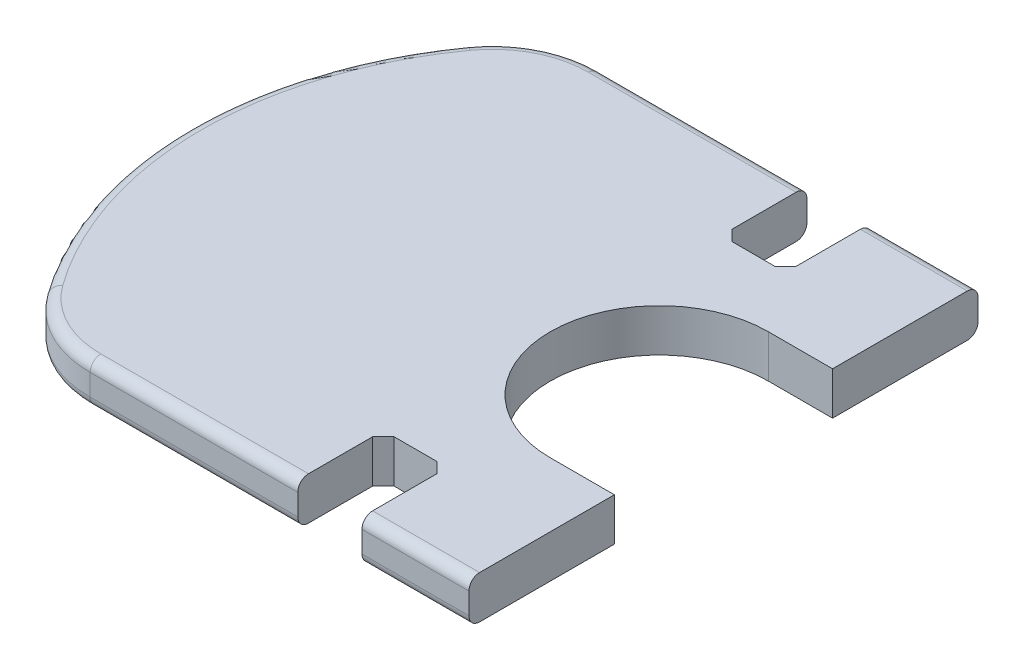
ISO-10303-21;
HEADER;
FILE_DESCRIPTION(('STEP AP214'),'2;1');
FILE_NAME('part.step','',(''),(''),'','','');
FILE_SCHEMA(('AUTOMOTIVE_DESIGN { 1 0 10303 214 1 1 1 1 }'));
ENDSEC;
DATA;
#1=APPLICATION_CONTEXT('core data for automotive mechanical design processes');
#2=APPLICATION_PROTOCOL_DEFINITION('international standard','automotive_design',2000,#1);
#3=PRODUCT_CONTEXT('',#1,'mechanical');
#4=PRODUCT('Part','Part','',(#3));
#5=PRODUCT_RELATED_PRODUCT_CATEGORY('part','',(#4));
#6=PRODUCT_DEFINITION_FORMATION('','',#4);
#7=PRODUCT_DEFINITION_CONTEXT('part definition',#1,'design');
#8=PRODUCT_DEFINITION('design','',#6,#7);
#9=PRODUCT_DEFINITION_SHAPE('','',#8);
#10=(LENGTH_UNIT() NAMED_UNIT(*) SI_UNIT(.MILLI.,.METRE.));
#11=(NAMED_UNIT(*) PLANE_ANGLE_UNIT() SI_UNIT($,.RADIAN.));
#12=(NAMED_UNIT(*) SI_UNIT($,.STERADIAN.) SOLID_ANGLE_UNIT());
#13=UNCERTAINTY_MEASURE_WITH_UNIT(LENGTH_MEASURE(1.E-05),#10,'distance_accuracy_value','');
#14=(GEOMETRIC_REPRESENTATION_CONTEXT(3) GLOBAL_UNCERTAINTY_ASSIGNED_CONTEXT((#13)) GLOBAL_UNIT_ASSIGNED_CONTEXT((#10,
#11,#12)) REPRESENTATION_CONTEXT('',''));
#15=CARTESIAN_POINT('',(0.,0.,0.));
#16=DIRECTION('',(0.,0.,1.));
#17=DIRECTION('',(1.,0.,0.));
#18=AXIS2_PLACEMENT_3D('',#15,#16,#17);
#19=CARTESIAN_POINT('',(3.,2.,-11.9));
#20=DIRECTION('',(0.,0.,1.));
#21=DIRECTION('',(1.,0.,0.));
#22=AXIS2_PLACEMENT_3D('',#19,#20,#21);
#23=PLANE('',#22);
#24=DIRECTION('',(-1.,0.,0.));
#25=VECTOR('',#24,1.);
#26=CARTESIAN_POINT('',(3.,0.5,-11.9));
#27=LINE('',#26,#25);
#28=CARTESIAN_POINT('',(3.,0.5,-11.9));
#29=VERTEX_POINT('',#28);
#30=CARTESIAN_POINT('',(-2.,0.5,-11.9));
#31=VERTEX_POINT('',#30);
#32=EDGE_CURVE('E315',#29,#31,#27,.T.);
#33=ORIENTED_EDGE('',*,*,#32,.T.);
#34=DIRECTION('',(0.,1.,0.));
#35=VECTOR('',#34,1.);
#36=CARTESIAN_POINT('',(-2.,2.,-11.9));
#37=LINE('',#36,#35);
#38=CARTESIAN_POINT('',(-2.,1.5,-11.9));
#39=VERTEX_POINT('',#38);
#40=EDGE_CURVE('E565',#31,#39,#37,.T.);
#41=ORIENTED_EDGE('',*,*,#40,.T.);
#42=DIRECTION('',(-1.,0.,0.));
#43=VECTOR('',#42,1.);
#44=CARTESIAN_POINT('',(3.,1.5,-11.9));
#45=LINE('',#44,#43);
#46=CARTESIAN_POINT('',(3.,1.5,-11.9));
#47=VERTEX_POINT('',#46);
#48=EDGE_CURVE('E309',#39,#47,#45,.F.);
#49=ORIENTED_EDGE('',*,*,#48,.T.);
#50=DIRECTION('',(0.,-1.,0.));
#51=VECTOR('',#50,1.);
#52=CARTESIAN_POINT('',(3.,2.,-11.9));
#53=LINE('',#52,#51);
#54=EDGE_CURVE('E661',#47,#29,#53,.T.);
#55=ORIENTED_EDGE('',*,*,#54,.T.);
#56=EDGE_LOOP('',(#33,#41,#49,#55));
#57=FACE_BOUND('',#56,.T.);
#58=ADVANCED_FACE('F40',(#57),#23,.F.);
#59=CARTESIAN_POINT('',(3.,2.,11.9));
#60=DIRECTION('',(0.,0.,-1.));
#61=DIRECTION('',(-1.,0.,0.));
#62=AXIS2_PLACEMENT_3D('',#59,#60,#61);
#63=PLANE('',#62);
#64=DIRECTION('',(1.,0.,0.));
#65=VECTOR('',#64,1.);
#66=CARTESIAN_POINT('',(-14.7082561413402,1.5,11.9));
#67=LINE('',#66,#65);
#68=CARTESIAN_POINT('',(3.,1.5,11.9));
#69=VERTEX_POINT('',#68);
#70=CARTESIAN_POINT('',(-2.,1.5,11.9));
#71=VERTEX_POINT('',#70);
#72=EDGE_CURVE('E296',#69,#71,#67,.F.);
#73=ORIENTED_EDGE('',*,*,#72,.T.);
#74=DIRECTION('',(0.,-1.,0.));
#75=VECTOR('',#74,1.);
#76=CARTESIAN_POINT('',(-2.,2.,11.9));
#77=LINE('',#76,#75);
#78=CARTESIAN_POINT('',(-2.,0.5,11.9));
#79=VERTEX_POINT('',#78);
#80=EDGE_CURVE('E255',#71,#79,#77,.T.);
#81=ORIENTED_EDGE('',*,*,#80,.T.);
#82=DIRECTION('',(1.,0.,0.));
#83=VECTOR('',#82,1.);
#84=CARTESIAN_POINT('',(3.,0.5,11.9));
#85=LINE('',#84,#83);
#86=CARTESIAN_POINT('',(3.,0.5,11.9));
#87=VERTEX_POINT('',#86);
#88=EDGE_CURVE('E299',#79,#87,#85,.T.);
#89=ORIENTED_EDGE('',*,*,#88,.T.);
#90=DIRECTION('',(0.,-1.,0.));
#91=VECTOR('',#90,1.);
#92=CARTESIAN_POINT('',(3.,2.,11.9));
#93=LINE('',#92,#91);
#94=EDGE_CURVE('E657',#69,#87,#93,.T.);
#95=ORIENTED_EDGE('',*,*,#94,.F.);
#96=EDGE_LOOP('',(#73,#81,#89,#95));
#97=FACE_BOUND('',#96,.T.);
#98=ADVANCED_FACE('F711',(#97),#63,.F.);
#99=CARTESIAN_POINT('',(3.,0.5,-11.4));
#100=DIRECTION('',(-1.,0.,0.));
#101=DIRECTION('',(0.,0.,1.));
#102=AXIS2_PLACEMENT_3D('',#99,#100,#101);
#103=CYLINDRICAL_SURFACE('',#102,0.5);
#104=CARTESIAN_POINT('',(-2.,0.5,-11.4));
#105=DIRECTION('',(1.,0.,0.));
#106=DIRECTION('',(0.,0.,-1.));
#107=AXIS2_PLACEMENT_3D('',#104,#105,#106);
#108=CIRCLE('',#107,0.5);
#109=CARTESIAN_POINT('',(-2.,0.,-11.4));
#110=VERTEX_POINT('',#109);
#111=EDGE_CURVE('E610',#31,#110,#108,.F.);
#112=ORIENTED_EDGE('',*,*,#111,.F.);
#113=ORIENTED_EDGE('',*,*,#32,.F.);
#114=CARTESIAN_POINT('',(3.,0.5,-11.4));
#115=DIRECTION('',(-1.,0.,0.));
#116=DIRECTION('',(0.,0.,1.));
#117=AXIS2_PLACEMENT_3D('',#114,#115,#116);
#118=CIRCLE('',#117,0.5);
#119=CARTESIAN_POINT('',(3.,0.,-11.4));
#120=VERTEX_POINT('',#119);
#121=EDGE_CURVE('E322',#120,#29,#118,.F.);
#122=ORIENTED_EDGE('',*,*,#121,.F.);
#123=DIRECTION('',(-1.,0.,0.));
#124=VECTOR('',#123,1.);
#125=CARTESIAN_POINT('',(0.,0.,-11.4));
#126=LINE('',#125,#124);
#127=EDGE_CURVE('E508',#110,#120,#126,.F.);
#128=ORIENTED_EDGE('',*,*,#127,.F.);
#129=EDGE_LOOP('',(#112,#113,#122,#128));
#130=FACE_BOUND('',#129,.T.);
#131=ADVANCED_FACE('F691',(#130),#103,.T.);
#132=CARTESIAN_POINT('',(3.,0.5,11.4));
#133=DIRECTION('',(1.,0.,0.));
#134=DIRECTION('',(0.,0.,-1.));
#135=AXIS2_PLACEMENT_3D('',#132,#133,#134);
#136=CYLINDRICAL_SURFACE('',#135,0.5);
#137=CARTESIAN_POINT('',(-2.,0.5,11.4));
#138=DIRECTION('',(1.,0.,0.));
#139=DIRECTION('',(0.,0.,-1.));
#140=AXIS2_PLACEMENT_3D('',#137,#138,#139);
#141=CIRCLE('',#140,0.5);
#142=CARTESIAN_POINT('',(-2.,0.,11.4));
#143=VERTEX_POINT('',#142);
#144=EDGE_CURVE('E597',#143,#79,#141,.F.);
#145=ORIENTED_EDGE('',*,*,#144,.F.);
#146=DIRECTION('',(1.,0.,0.));
#147=VECTOR('',#146,1.);
#148=CARTESIAN_POINT('',(0.,0.,11.4));
#149=LINE('',#148,#147);
#150=CARTESIAN_POINT('',(3.,0.,11.4));
#151=VERTEX_POINT('',#150);
#152=EDGE_CURVE('E450',#151,#143,#149,.F.);
#153=ORIENTED_EDGE('',*,*,#152,.F.);
#154=CARTESIAN_POINT('',(3.,0.5,11.4));
#155=DIRECTION('',(-1.,0.,0.));
#156=DIRECTION('',(0.,0.,1.));
#157=AXIS2_PLACEMENT_3D('',#154,#155,#156);
#158=CIRCLE('',#157,0.5);
#159=EDGE_CURVE('E306',#87,#151,#158,.F.);
#160=ORIENTED_EDGE('',*,*,#159,.F.);
#161=ORIENTED_EDGE('',*,*,#88,.F.);
#162=EDGE_LOOP('',(#145,#153,#160,#161));
#163=FACE_BOUND('',#162,.T.);
#164=ADVANCED_FACE('F708',(#163),#136,.T.);
#165=CARTESIAN_POINT('',(0.,1.5,-11.4));
#166=DIRECTION('',(1.,0.,0.));
#167=DIRECTION('',(0.,0.,-1.));
#168=AXIS2_PLACEMENT_3D('',#165,#166,#167);
#169=CYLINDRICAL_SURFACE('',#168,0.5);
#170=CARTESIAN_POINT('',(-2.,1.5,-11.4));
#171=DIRECTION('',(1.,0.,0.));
#172=DIRECTION('',(0.,0.,-1.));
#173=AXIS2_PLACEMENT_3D('',#170,#171,#172);
#174=CIRCLE('',#173,0.5);
#175=CARTESIAN_POINT('',(-2.,2.,-11.4));
#176=VERTEX_POINT('',#175);
#177=EDGE_CURVE('E361',#176,#39,#174,.F.);
#178=ORIENTED_EDGE('',*,*,#177,.F.);
#179=DIRECTION('',(-1.,0.,0.));
#180=VECTOR('',#179,1.);
#181=CARTESIAN_POINT('',(-14.7082561413402,2.,-11.4));
#182=LINE('',#181,#180);
#183=CARTESIAN_POINT('',(3.,2.,-11.4));
#184=VERTEX_POINT('',#183);
#185=EDGE_CURVE('E489',#184,#176,#182,.T.);
#186=ORIENTED_EDGE('',*,*,#185,.F.);
#187=CARTESIAN_POINT('',(3.,1.5,-11.4));
#188=DIRECTION('',(-1.,0.,0.));
#189=DIRECTION('',(0.,0.,1.));
#190=AXIS2_PLACEMENT_3D('',#187,#188,#189);
#191=CIRCLE('',#190,0.5);
#192=EDGE_CURVE('E319',#47,#184,#191,.F.);
#193=ORIENTED_EDGE('',*,*,#192,.F.);
#194=ORIENTED_EDGE('',*,*,#48,.F.);
#195=EDGE_LOOP('',(#178,#186,#193,#194));
#196=FACE_BOUND('',#195,.T.);
#197=ADVANCED_FACE('F698',(#196),#169,.T.);
#198=CARTESIAN_POINT('',(0.,1.5,11.4));
#199=DIRECTION('',(-1.,0.,0.));
#200=DIRECTION('',(0.,0.,1.));
#201=AXIS2_PLACEMENT_3D('',#198,#199,#200);
#202=CYLINDRICAL_SURFACE('',#201,0.5);
#203=CARTESIAN_POINT('',(-2.,1.5,11.4));
#204=DIRECTION('',(1.,0.,0.));
#205=DIRECTION('',(0.,0.,-1.));
#206=AXIS2_PLACEMENT_3D('',#203,#204,#205);
#207=CIRCLE('',#206,0.5);
#208=CARTESIAN_POINT('',(-2.,2.,11.4));
#209=VERTEX_POINT('',#208);
#210=EDGE_CURVE('E249',#71,#209,#207,.F.);
#211=ORIENTED_EDGE('',*,*,#210,.F.);
#212=ORIENTED_EDGE('',*,*,#72,.F.);
#213=CARTESIAN_POINT('',(3.,1.5,11.4));
#214=DIRECTION('',(-1.,0.,0.));
#215=DIRECTION('',(0.,0.,1.));
#216=AXIS2_PLACEMENT_3D('',#213,#214,#215);
#217=CIRCLE('',#216,0.5);
#218=CARTESIAN_POINT('',(3.,2.,11.4));
#219=VERTEX_POINT('',#218);
#220=EDGE_CURVE('E276',#219,#69,#217,.F.);
#221=ORIENTED_EDGE('',*,*,#220,.F.);
#222=DIRECTION('',(1.,0.,0.));
#223=VECTOR('',#222,1.);
#224=CARTESIAN_POINT('',(3.,2.,11.4));
#225=LINE('',#224,#223);
#226=EDGE_CURVE('E266',#209,#219,#225,.T.);
#227=ORIENTED_EDGE('',*,*,#226,.F.);
#228=EDGE_LOOP('',(#211,#212,#221,#227));
#229=FACE_BOUND('',#228,.T.);
#230=ADVANCED_FACE('F275',(#229),#202,.T.);
#231=CARTESIAN_POINT('',(0.,2.,0.));
#232=DIRECTION('',(0.,-1.,0.));
#233=DIRECTION('',(0.,0.,-1.));
#234=AXIS2_PLACEMENT_3D('',#231,#232,#233);
#235=CYLINDRICAL_SURFACE('',#234,5.1);
#236=CARTESIAN_POINT('',(0.,0.,0.));
#237=DIRECTION('',(0.,-1.,0.));
#238=DIRECTION('',(0.,0.,1.));
#239=AXIS2_PLACEMENT_3D('',#236,#237,#238);
#240=CIRCLE('',#239,5.1);
#241=CARTESIAN_POINT('',(0.,0.,5.1));
#242=VERTEX_POINT('',#241);
#243=CARTESIAN_POINT('',(0.,0.,-5.1));
#244=VERTEX_POINT('',#243);
#245=EDGE_CURVE('E341',#242,#244,#240,.T.);
#246=ORIENTED_EDGE('',*,*,#245,.T.);
#247=DIRECTION('',(0.,-1.,0.));
#248=VECTOR('',#247,1.);
#249=CARTESIAN_POINT('',(0.,2.,-5.1));
#250=LINE('',#249,#248);
#251=CARTESIAN_POINT('',(0.,2.,-5.1));
#252=VERTEX_POINT('',#251);
#253=EDGE_CURVE('E442',#252,#244,#250,.T.);
#254=ORIENTED_EDGE('',*,*,#253,.F.);
#255=CARTESIAN_POINT('',(0.,2.,0.));
#256=DIRECTION('',(0.,-1.,0.));
#257=DIRECTION('',(0.,0.,1.));
#258=AXIS2_PLACEMENT_3D('',#255,#256,#257);
#259=CIRCLE('',#258,5.1);
#260=CARTESIAN_POINT('',(0.,2.,5.1));
#261=VERTEX_POINT('',#260);
#262=EDGE_CURVE('E616',#261,#252,#259,.T.);
#263=ORIENTED_EDGE('',*,*,#262,.F.);
#264=DIRECTION('',(0.,-1.,0.));
#265=VECTOR('',#264,1.);
#266=CARTESIAN_POINT('',(0.,2.,5.1));
#267=LINE('',#266,#265);
#268=EDGE_CURVE('E634',#261,#242,#267,.T.);
#269=ORIENTED_EDGE('',*,*,#268,.T.);
#270=EDGE_LOOP('',(#246,#254,#263,#269));
#271=FACE_BOUND('',#270,.T.);
#272=ADVANCED_FACE('F678',(#271),#235,.F.);
#273=CARTESIAN_POINT('',(0.,2.,-5.1));
#274=DIRECTION('',(0.,0.,-1.));
#275=DIRECTION('',(-1.,0.,0.));
#276=AXIS2_PLACEMENT_3D('',#273,#274,#275);
#277=PLANE('',#276);
#278=DIRECTION('',(1.,0.,0.));
#279=VECTOR('',#278,1.);
#280=CARTESIAN_POINT('',(0.,0.,-5.1));
#281=LINE('',#280,#279);
#282=CARTESIAN_POINT('',(3.,0.,-5.1));
#283=VERTEX_POINT('',#282);
#284=EDGE_CURVE('E638',#244,#283,#281,.T.);
#285=ORIENTED_EDGE('',*,*,#284,.T.);
#286=DIRECTION('',(0.,-1.,0.));
#287=VECTOR('',#286,1.);
#288=CARTESIAN_POINT('',(3.,2.,-5.1));
#289=LINE('',#288,#287);
#290=CARTESIAN_POINT('',(3.,2.,-5.1));
#291=VERTEX_POINT('',#290);
#292=EDGE_CURVE('E665',#291,#283,#289,.T.);
#293=ORIENTED_EDGE('',*,*,#292,.F.);
#294=DIRECTION('',(1.,0.,0.));
#295=VECTOR('',#294,1.);
#296=CARTESIAN_POINT('',(0.,2.,-5.1));
#297=LINE('',#296,#295);
#298=EDGE_CURVE('E620',#252,#291,#297,.T.);
#299=ORIENTED_EDGE('',*,*,#298,.F.);
#300=ORIENTED_EDGE('',*,*,#253,.T.);
#301=EDGE_LOOP('',(#285,#293,#299,#300));
#302=FACE_BOUND('',#301,.T.);
#303=ADVANCED_FACE('F673',(#302),#277,.F.);
#304=CARTESIAN_POINT('',(3.,2.,-5.1));
#305=DIRECTION('',(-1.,0.,0.));
#306=DIRECTION('',(0.,0.,1.));
#307=AXIS2_PLACEMENT_3D('',#304,#305,#306);
#308=PLANE('',#307);
#309=DIRECTION('',(0.,0.,-1.));
#310=VECTOR('',#309,1.);
#311=CARTESIAN_POINT('',(3.,0.,-5.1));
#312=LINE('',#311,#310);
#313=EDGE_CURVE('E641',#283,#120,#312,.T.);
#314=ORIENTED_EDGE('',*,*,#313,.T.);
#315=ORIENTED_EDGE('',*,*,#121,.T.);
#316=ORIENTED_EDGE('',*,*,#54,.F.);
#317=ORIENTED_EDGE('',*,*,#192,.T.);
#318=DIRECTION('',(0.,0.,-1.));
#319=VECTOR('',#318,1.);
#320=CARTESIAN_POINT('',(3.,2.,-5.1));
#321=LINE('',#320,#319);
#322=EDGE_CURVE('E624',#291,#184,#321,.T.);
#323=ORIENTED_EDGE('',*,*,#322,.F.);
#324=ORIENTED_EDGE('',*,*,#292,.T.);
#325=EDGE_LOOP('',(#314,#315,#316,#317,#323,#324));
#326=FACE_BOUND('',#325,.T.);
#327=ADVANCED_FACE('F685',(#326),#308,.F.);
#328=CARTESIAN_POINT('',(-14.7082561413402,1.5,-11.9));
#329=VERTEX_POINT('',#328);
#330=CARTESIAN_POINT('',(-5.,1.5,-11.9));
#331=VERTEX_POINT('',#330);
#332=EDGE_CURVE('E310',#329,#331,#45,.F.);
#333=ORIENTED_EDGE('',*,*,#332,.T.);
#334=DIRECTION('',(0.,-1.,0.));
#335=VECTOR('',#334,1.);
#336=CARTESIAN_POINT('',(-5.,2.,-11.9));
#337=LINE('',#336,#335);
#338=CARTESIAN_POINT('',(-5.,0.5,-11.9));
#339=VERTEX_POINT('',#338);
#340=EDGE_CURVE('E503',#331,#339,#337,.T.);
#341=ORIENTED_EDGE('',*,*,#340,.T.);
#342=CARTESIAN_POINT('',(-14.7082561413402,0.5,-11.9));
#343=VERTEX_POINT('',#342);
#344=EDGE_CURVE('E314',#339,#343,#27,.T.);
#345=ORIENTED_EDGE('',*,*,#344,.T.);
#346=DIRECTION('',(0.,-1.,0.));
#347=VECTOR('',#346,1.);
#348=CARTESIAN_POINT('',(-14.7082561413402,2.,-11.9));
#349=LINE('',#348,#347);
#350=EDGE_CURVE('E505',#343,#329,#349,.F.);
#351=ORIENTED_EDGE('',*,*,#350,.T.);
#352=EDGE_LOOP('',(#333,#341,#345,#351));
#353=FACE_BOUND('',#352,.T.);
#354=ADVANCED_FACE('F502',(#353),#23,.F.);
#355=CARTESIAN_POINT('',(-5.09999999999997,2.,0.));
#356=DIRECTION('',(0.,-1.,0.));
#357=DIRECTION('',(0.,0.,-1.));
#358=AXIS2_PLACEMENT_3D('',#355,#356,#357);
#359=CYLINDRICAL_SURFACE('',#358,16.8291413922398);
#360=DIRECTION('',(0.,-1.,0.));
#361=VECTOR('',#360,1.);
#362=CARTESIAN_POINT('',(-18.7695213772277,2.,-9.81652613287999));
#363=LINE('',#362,#361);
#364=CARTESIAN_POINT('',(-18.7695213772277,1.5,-9.81652613287999));
#365=VERTEX_POINT('',#364);
#366=CARTESIAN_POINT('',(-18.7695213772277,0.5,-9.81652613287999));
#367=VERTEX_POINT('',#366);
#368=EDGE_CURVE('E441',#365,#367,#363,.T.);
#369=ORIENTED_EDGE('',*,*,#368,.T.);
#370=CARTESIAN_POINT('',(-5.09999999999997,0.5,0.));
#371=DIRECTION('',(0.,1.,0.));
#372=DIRECTION('',(0.,0.,1.));
#373=AXIS2_PLACEMENT_3D('',#370,#371,#372);
#374=CIRCLE('',#373,16.8291413922398);
#375=CARTESIAN_POINT('',(-18.7695213772277,0.5,9.81652613287999));
#376=VERTEX_POINT('',#375);
#377=EDGE_CURVE('E292',#367,#376,#374,.T.);
#378=ORIENTED_EDGE('',*,*,#377,.T.);
#379=DIRECTION('',(0.,-1.,0.));
#380=VECTOR('',#379,1.);
#381=CARTESIAN_POINT('',(-18.7695213772277,2.,9.81652613287999));
#382=LINE('',#381,#380);
#383=CARTESIAN_POINT('',(-18.7695213772277,1.5,9.81652613287999));
#384=VERTEX_POINT('',#383);
#385=EDGE_CURVE('E467',#376,#384,#382,.F.);
#386=ORIENTED_EDGE('',*,*,#385,.T.);
#387=CARTESIAN_POINT('',(-5.09999999999997,1.5,0.));
#388=DIRECTION('',(0.,1.,0.));
#389=DIRECTION('',(0.,0.,1.));
#390=AXIS2_PLACEMENT_3D('',#387,#388,#389);
#391=CIRCLE('',#390,16.8291413922398);
#392=EDGE_CURVE('E284',#384,#365,#391,.F.);
#393=ORIENTED_EDGE('',*,*,#392,.T.);
#394=EDGE_LOOP('',(#369,#378,#386,#393));
#395=FACE_BOUND('',#394,.T.);
#396=ADVANCED_FACE('F465',(#395),#359,.T.);
#397=CARTESIAN_POINT('',(-14.7082561413402,0.5,11.9));
#398=VERTEX_POINT('',#397);
#399=CARTESIAN_POINT('',(-5.,0.5,11.9));
#400=VERTEX_POINT('',#399);
#401=EDGE_CURVE('E300',#398,#400,#85,.T.);
#402=ORIENTED_EDGE('',*,*,#401,.T.);
#403=DIRECTION('',(0.,1.,0.));
#404=VECTOR('',#403,1.);
#405=CARTESIAN_POINT('',(-5.,2.,11.9));
#406=LINE('',#405,#404);
#407=CARTESIAN_POINT('',(-5.,1.5,11.9));
#408=VERTEX_POINT('',#407);
#409=EDGE_CURVE('E428',#400,#408,#406,.T.);
#410=ORIENTED_EDGE('',*,*,#409,.T.);
#411=CARTESIAN_POINT('',(-14.7082561413402,1.5,11.9));
#412=VERTEX_POINT('',#411);
#413=EDGE_CURVE('E295',#408,#412,#67,.F.);
#414=ORIENTED_EDGE('',*,*,#413,.T.);
#415=DIRECTION('',(0.,-1.,0.));
#416=VECTOR('',#415,1.);
#417=CARTESIAN_POINT('',(-14.7082561413402,2.,11.9));
#418=LINE('',#417,#416);
#419=EDGE_CURVE('E426',#412,#398,#418,.T.);
#420=ORIENTED_EDGE('',*,*,#419,.T.);
#421=EDGE_LOOP('',(#402,#410,#414,#420));
#422=FACE_BOUND('',#421,.T.);
#423=ADVANCED_FACE('F425',(#422),#63,.F.);
#424=CARTESIAN_POINT('',(3.,2.,5.1));
#425=DIRECTION('',(-1.,0.,0.));
#426=DIRECTION('',(0.,0.,1.));
#427=AXIS2_PLACEMENT_3D('',#424,#425,#426);
#428=PLANE('',#427);
#429=ORIENTED_EDGE('',*,*,#94,.T.);
#430=ORIENTED_EDGE('',*,*,#159,.T.);
#431=DIRECTION('',(0.,0.,-1.));
#432=VECTOR('',#431,1.);
#433=CARTESIAN_POINT('',(3.,0.,5.1));
#434=LINE('',#433,#432);
#435=CARTESIAN_POINT('',(3.,0.,5.1));
#436=VERTEX_POINT('',#435);
#437=EDGE_CURVE('E645',#151,#436,#434,.T.);
#438=ORIENTED_EDGE('',*,*,#437,.T.);
#439=DIRECTION('',(0.,-1.,0.));
#440=VECTOR('',#439,1.);
#441=CARTESIAN_POINT('',(3.,2.,5.1));
#442=LINE('',#441,#440);
#443=CARTESIAN_POINT('',(3.,2.,5.1));
#444=VERTEX_POINT('',#443);
#445=EDGE_CURVE('E653',#444,#436,#442,.T.);
#446=ORIENTED_EDGE('',*,*,#445,.F.);
#447=DIRECTION('',(0.,0.,-1.));
#448=VECTOR('',#447,1.);
#449=CARTESIAN_POINT('',(3.,2.,5.1));
#450=LINE('',#449,#448);
#451=EDGE_CURVE('E628',#219,#444,#450,.T.);
#452=ORIENTED_EDGE('',*,*,#451,.F.);
#453=ORIENTED_EDGE('',*,*,#220,.T.);
#454=EDGE_LOOP('',(#429,#430,#438,#446,#452,#453));
#455=FACE_BOUND('',#454,.T.);
#456=ADVANCED_FACE('F704',(#455),#428,.F.);
#457=CARTESIAN_POINT('',(0.,2.,5.1));
#458=DIRECTION('',(0.,0.,1.));
#459=DIRECTION('',(1.,0.,0.));
#460=AXIS2_PLACEMENT_3D('',#457,#458,#459);
#461=PLANE('',#460);
#462=DIRECTION('',(-1.,0.,0.));
#463=VECTOR('',#462,1.);
#464=CARTESIAN_POINT('',(0.,0.,5.1));
#465=LINE('',#464,#463);
#466=EDGE_CURVE('E621',#436,#242,#465,.T.);
#467=ORIENTED_EDGE('',*,*,#466,.T.);
#468=ORIENTED_EDGE('',*,*,#268,.F.);
#469=DIRECTION('',(-1.,0.,0.));
#470=VECTOR('',#469,1.);
#471=CARTESIAN_POINT('',(0.,2.,5.1));
#472=LINE('',#471,#470);
#473=EDGE_CURVE('E631',#444,#261,#472,.T.);
#474=ORIENTED_EDGE('',*,*,#473,.F.);
#475=ORIENTED_EDGE('',*,*,#445,.T.);
#476=EDGE_LOOP('',(#467,#468,#474,#475));
#477=FACE_BOUND('',#476,.T.);
#478=ADVANCED_FACE('F702',(#477),#461,.F.);
#479=CARTESIAN_POINT('',(0.,2.,0.));
#480=DIRECTION('',(0.,1.,0.));
#481=DIRECTION('',(0.,0.,1.));
#482=AXIS2_PLACEMENT_3D('',#479,#480,#481);
#483=PLANE('',#482);
#484=DIRECTION('',(0.,0.,-1.));
#485=VECTOR('',#484,1.);
#486=CARTESIAN_POINT('',(-2.,2.,-7.9));
#487=LINE('',#486,#485);
#488=CARTESIAN_POINT('',(-2.,2.,-8.4));
#489=VERTEX_POINT('',#488);
#490=EDGE_CURVE('E575',#489,#176,#487,.T.);
#491=ORIENTED_EDGE('',*,*,#490,.F.);
#492=DIRECTION('',(0.707106781186543,0.,-0.707106781186552));
#493=VECTOR('',#492,1.);
#494=CARTESIAN_POINT('',(-2.,2.,-8.4));
#495=LINE('',#494,#493);
#496=CARTESIAN_POINT('',(-2.49999999999999,2.,-7.9));
#497=VERTEX_POINT('',#496);
#498=EDGE_CURVE('E410',#489,#497,#495,.F.);
#499=ORIENTED_EDGE('',*,*,#498,.T.);
#500=DIRECTION('',(1.,0.,0.));
#501=VECTOR('',#500,1.);
#502=CARTESIAN_POINT('',(-5.,2.,-7.9));
#503=LINE('',#502,#501);
#504=CARTESIAN_POINT('',(-4.49999999999999,2.,-7.9));
#505=VERTEX_POINT('',#504);
#506=EDGE_CURVE('E572',#505,#497,#503,.T.);
#507=ORIENTED_EDGE('',*,*,#506,.F.);
#508=DIRECTION('',(0.707106781186552,0.,0.707106781186543));
#509=VECTOR('',#508,1.);
#510=CARTESIAN_POINT('',(-4.49999999999999,2.,-7.9));
#511=LINE('',#510,#509);
#512=CARTESIAN_POINT('',(-5.,2.,-8.4));
#513=VERTEX_POINT('',#512);
#514=EDGE_CURVE('E49',#505,#513,#511,.F.);
#515=ORIENTED_EDGE('',*,*,#514,.T.);
#516=DIRECTION('',(0.,0.,1.));
#517=VECTOR('',#516,1.);
#518=CARTESIAN_POINT('',(-5.,2.,-14.9));
#519=LINE('',#518,#517);
#520=CARTESIAN_POINT('',(-5.,2.,-11.4));
#521=VERTEX_POINT('',#520);
#522=EDGE_CURVE('E271',#521,#513,#519,.T.);
#523=ORIENTED_EDGE('',*,*,#522,.F.);
#524=CARTESIAN_POINT('',(-14.7082561413402,2.,-11.4));
#525=VERTEX_POINT('',#524);
#526=EDGE_CURVE('E485',#521,#525,#182,.T.);
#527=ORIENTED_EDGE('',*,*,#526,.T.);
#528=CARTESIAN_POINT('',(-14.7082561413402,2.,-6.9));
#529=DIRECTION('',(0.,1.,0.));
#530=DIRECTION('',(0.,0.,1.));
#531=AXIS2_PLACEMENT_3D('',#528,#529,#530);
#532=CIRCLE('',#531,4.5);
#533=CARTESIAN_POINT('',(-18.3633948536389,2.,-9.52487351959199));
#534=VERTEX_POINT('',#533);
#535=EDGE_CURVE('E456',#525,#534,#532,.T.);
#536=ORIENTED_EDGE('',*,*,#535,.T.);
#537=CARTESIAN_POINT('',(-5.09999999999997,2.,0.));
#538=DIRECTION('',(0.,1.,0.));
#539=DIRECTION('',(0.,0.,1.));
#540=AXIS2_PLACEMENT_3D('',#537,#538,#539);
#541=CIRCLE('',#540,16.3291413922398);
#542=CARTESIAN_POINT('',(-18.3633948536389,2.,9.52487351959199));
#543=VERTEX_POINT('',#542);
#544=EDGE_CURVE('E286',#534,#543,#541,.T.);
#545=ORIENTED_EDGE('',*,*,#544,.T.);
#546=CARTESIAN_POINT('',(-14.7082561413402,2.,6.9));
#547=DIRECTION('',(0.,1.,0.));
#548=DIRECTION('',(0.,0.,1.));
#549=AXIS2_PLACEMENT_3D('',#546,#547,#548);
#550=CIRCLE('',#549,4.5);
#551=CARTESIAN_POINT('',(-14.7082561413402,2.,11.4));
#552=VERTEX_POINT('',#551);
#553=EDGE_CURVE('E279',#543,#552,#550,.T.);
#554=ORIENTED_EDGE('',*,*,#553,.T.);
#555=CARTESIAN_POINT('',(-5.,2.,11.4));
#556=VERTEX_POINT('',#555);
#557=EDGE_CURVE('E278',#552,#556,#225,.T.);
#558=ORIENTED_EDGE('',*,*,#557,.T.);
#559=DIRECTION('',(0.,0.,1.));
#560=VECTOR('',#559,1.);
#561=CARTESIAN_POINT('',(-5.,2.,14.9));
#562=LINE('',#561,#560);
#563=CARTESIAN_POINT('',(-5.,2.,8.4));
#564=VERTEX_POINT('',#563);
#565=EDGE_CURVE('E272',#564,#556,#562,.T.);
#566=ORIENTED_EDGE('',*,*,#565,.F.);
#567=DIRECTION('',(-0.707106781186545,0.,0.70710678118655));
#568=VECTOR('',#567,1.);
#569=CARTESIAN_POINT('',(-5.,2.,8.4));
#570=LINE('',#569,#568);
#571=CARTESIAN_POINT('',(-4.5,2.,7.9));
#572=VERTEX_POINT('',#571);
#573=EDGE_CURVE('E404',#564,#572,#570,.F.);
#574=ORIENTED_EDGE('',*,*,#573,.T.);
#575=DIRECTION('',(-1.,0.,0.));
#576=VECTOR('',#575,1.);
#577=CARTESIAN_POINT('',(-5.,2.,7.9));
#578=LINE('',#577,#576);
#579=CARTESIAN_POINT('',(-2.50000000000001,2.,7.9));
#580=VERTEX_POINT('',#579);
#581=EDGE_CURVE('E582',#580,#572,#578,.T.);
#582=ORIENTED_EDGE('',*,*,#581,.F.);
#583=DIRECTION('',(-0.707106781186552,0.,-0.707106781186543));
#584=VECTOR('',#583,1.);
#585=CARTESIAN_POINT('',(-2.50000000000001,2.,7.9));
#586=LINE('',#585,#584);
#587=CARTESIAN_POINT('',(-2.,2.,8.4));
#588=VERTEX_POINT('',#587);
#589=EDGE_CURVE('E269',#580,#588,#586,.F.);
#590=ORIENTED_EDGE('',*,*,#589,.T.);
#591=DIRECTION('',(0.,0.,-1.));
#592=VECTOR('',#591,1.);
#593=CARTESIAN_POINT('',(-2.,2.,7.9));
#594=LINE('',#593,#592);
#595=EDGE_CURVE('E252',#209,#588,#594,.T.);
#596=ORIENTED_EDGE('',*,*,#595,.F.);
#597=ORIENTED_EDGE('',*,*,#226,.T.);
#598=ORIENTED_EDGE('',*,*,#451,.T.);
#599=ORIENTED_EDGE('',*,*,#473,.T.);
#600=ORIENTED_EDGE('',*,*,#262,.T.);
#601=ORIENTED_EDGE('',*,*,#298,.T.);
#602=ORIENTED_EDGE('',*,*,#322,.T.);
#603=ORIENTED_EDGE('',*,*,#185,.T.);
#604=EDGE_LOOP('',(#491,#499,#507,#515,#523,#527,#536,#545,#554,#558,#566,#574,#582,#590,#596,
#597,#598,#599,#600,#601,#602,#603));
#605=FACE_BOUND('',#604,.T.);
#606=ADVANCED_FACE('F265',(#605),#483,.T.);
#607=CARTESIAN_POINT('',(0.,0.,0.));
#608=DIRECTION('',(0.,1.,0.));
#609=DIRECTION('',(0.,0.,1.));
#610=AXIS2_PLACEMENT_3D('',#607,#608,#609);
#611=PLANE('',#610);
#612=DIRECTION('',(0.,0.,1.));
#613=VECTOR('',#612,1.);
#614=CARTESIAN_POINT('',(-5.,0.,0.));
#615=LINE('',#614,#613);
#616=CARTESIAN_POINT('',(-5.,0.,-11.4));
#617=VERTEX_POINT('',#616);
#618=CARTESIAN_POINT('',(-5.,0.,-8.4));
#619=VERTEX_POINT('',#618);
#620=EDGE_CURVE('E561',#617,#619,#615,.T.);
#621=ORIENTED_EDGE('',*,*,#620,.T.);
#622=DIRECTION('',(-0.707106781186552,0.,-0.707106781186543));
#623=VECTOR('',#622,1.);
#624=CARTESIAN_POINT('',(1.70000000000004,0.,-1.70000000000006));
#625=LINE('',#624,#623);
#626=CARTESIAN_POINT('',(-4.49999999999999,0.,-7.9));
#627=VERTEX_POINT('',#626);
#628=EDGE_CURVE('E11',#619,#627,#625,.F.);
#629=ORIENTED_EDGE('',*,*,#628,.T.);
#630=DIRECTION('',(1.,0.,0.));
#631=VECTOR('',#630,1.);
#632=CARTESIAN_POINT('',(0.,0.,-7.9));
#633=LINE('',#632,#631);
#634=CARTESIAN_POINT('',(-2.49999999999999,0.,-7.9));
#635=VERTEX_POINT('',#634);
#636=EDGE_CURVE('E368',#627,#635,#633,.T.);
#637=ORIENTED_EDGE('',*,*,#636,.T.);
#638=DIRECTION('',(-0.707106781186543,0.,0.707106781186552));
#639=VECTOR('',#638,1.);
#640=CARTESIAN_POINT('',(-5.20000000000001,0.,-5.19999999999994));
#641=LINE('',#640,#639);
#642=CARTESIAN_POINT('',(-2.,0.,-8.4));
#643=VERTEX_POINT('',#642);
#644=EDGE_CURVE('E413',#635,#643,#641,.F.);
#645=ORIENTED_EDGE('',*,*,#644,.T.);
#646=DIRECTION('',(0.,0.,-1.));
#647=VECTOR('',#646,1.);
#648=CARTESIAN_POINT('',(-2.,0.,0.));
#649=LINE('',#648,#647);
#650=EDGE_CURVE('E346',#643,#110,#649,.T.);
#651=ORIENTED_EDGE('',*,*,#650,.T.);
#652=ORIENTED_EDGE('',*,*,#127,.T.);
#653=ORIENTED_EDGE('',*,*,#313,.F.);
#654=ORIENTED_EDGE('',*,*,#284,.F.);
#655=ORIENTED_EDGE('',*,*,#245,.F.);
#656=ORIENTED_EDGE('',*,*,#466,.F.);
#657=ORIENTED_EDGE('',*,*,#437,.F.);
#658=ORIENTED_EDGE('',*,*,#152,.T.);
#659=DIRECTION('',(0.,0.,-1.));
#660=VECTOR('',#659,1.);
#661=CARTESIAN_POINT('',(-2.,0.,0.));
#662=LINE('',#661,#660);
#663=CARTESIAN_POINT('',(-2.,0.,8.4));
#664=VERTEX_POINT('',#663);
#665=EDGE_CURVE('E600',#143,#664,#662,.T.);
#666=ORIENTED_EDGE('',*,*,#665,.T.);
#667=DIRECTION('',(0.707106781186552,0.,0.707106781186543));
#668=VECTOR('',#667,1.);
#669=CARTESIAN_POINT('',(-5.19999999999998,0.,5.20000000000006));
#670=LINE('',#669,#668);
#671=CARTESIAN_POINT('',(-2.50000000000001,0.,7.9));
#672=VERTEX_POINT('',#671);
#673=EDGE_CURVE('E401',#664,#672,#670,.F.);
#674=ORIENTED_EDGE('',*,*,#673,.T.);
#675=DIRECTION('',(-1.,0.,0.));
#676=VECTOR('',#675,1.);
#677=CARTESIAN_POINT('',(0.,0.,7.9));
#678=LINE('',#677,#676);
#679=CARTESIAN_POINT('',(-4.5,0.,7.9));
#680=VERTEX_POINT('',#679);
#681=EDGE_CURVE('E364',#672,#680,#678,.T.);
#682=ORIENTED_EDGE('',*,*,#681,.T.);
#683=DIRECTION('',(0.707106781186545,0.,-0.70710678118655));
#684=VECTOR('',#683,1.);
#685=CARTESIAN_POINT('',(1.69999999999998,0.,1.69999999999997));
#686=LINE('',#685,#684);
#687=CARTESIAN_POINT('',(-5.,0.,8.4));
#688=VERTEX_POINT('',#687);
#689=EDGE_CURVE('E407',#680,#688,#686,.F.);
#690=ORIENTED_EDGE('',*,*,#689,.T.);
#691=DIRECTION('',(0.,0.,1.));
#692=VECTOR('',#691,1.);
#693=CARTESIAN_POINT('',(-5.,0.,0.));
#694=LINE('',#693,#692);
#695=CARTESIAN_POINT('',(-5.,0.,11.4));
#696=VERTEX_POINT('',#695);
#697=EDGE_CURVE('E541',#688,#696,#694,.T.);
#698=ORIENTED_EDGE('',*,*,#697,.T.);
#699=CARTESIAN_POINT('',(-14.7082561413402,0.,11.4));
#700=VERTEX_POINT('',#699);
#701=EDGE_CURVE('E528',#696,#700,#149,.F.);
#702=ORIENTED_EDGE('',*,*,#701,.T.);
#703=CARTESIAN_POINT('',(-14.7082561413402,0.,6.9));
#704=DIRECTION('',(0.,1.,0.));
#705=DIRECTION('',(0.,0.,1.));
#706=AXIS2_PLACEMENT_3D('',#703,#704,#705);
#707=CIRCLE('',#706,4.5);
#708=CARTESIAN_POINT('',(-18.3633948536389,0.,9.52487351959199));
#709=VERTEX_POINT('',#708);
#710=EDGE_CURVE('E524',#700,#709,#707,.F.);
#711=ORIENTED_EDGE('',*,*,#710,.T.);
#712=CARTESIAN_POINT('',(-5.09999999999997,0.,0.));
#713=DIRECTION('',(0.,1.,0.));
#714=DIRECTION('',(0.,0.,1.));
#715=AXIS2_PLACEMENT_3D('',#712,#713,#714);
#716=CIRCLE('',#715,16.3291413922398);
#717=CARTESIAN_POINT('',(-18.3633948536389,0.,-9.52487351959199));
#718=VERTEX_POINT('',#717);
#719=EDGE_CURVE('E521',#709,#718,#716,.F.);
#720=ORIENTED_EDGE('',*,*,#719,.T.);
#721=CARTESIAN_POINT('',(-14.7082561413402,0.,-6.9));
#722=DIRECTION('',(0.,1.,0.));
#723=DIRECTION('',(0.,0.,1.));
#724=AXIS2_PLACEMENT_3D('',#721,#722,#723);
#725=CIRCLE('',#724,4.5);
#726=CARTESIAN_POINT('',(-14.7082561413402,0.,-11.4));
#727=VERTEX_POINT('',#726);
#728=EDGE_CURVE('E518',#718,#727,#725,.F.);
#729=ORIENTED_EDGE('',*,*,#728,.T.);
#730=EDGE_CURVE('E512',#727,#617,#126,.F.);
#731=ORIENTED_EDGE('',*,*,#730,.T.);
#732=EDGE_LOOP('',(#621,#629,#637,#645,#651,#652,#653,#654,#655,#656,#657,#658,#666,#674,#682,
#690,#698,#702,#711,#720,#729,#731));
#733=FACE_BOUND('',#732,.T.);
#734=ADVANCED_FACE('F538',(#733),#611,.F.);
#735=CARTESIAN_POINT('',(-14.7082561413402,2.,6.9));
#736=DIRECTION('',(0.,-1.,0.));
#737=DIRECTION('',(0.,0.,-1.));
#738=AXIS2_PLACEMENT_3D('',#735,#736,#737);
#739=CYLINDRICAL_SURFACE('',#738,5.);
#740=ORIENTED_EDGE('',*,*,#385,.F.);
#741=CARTESIAN_POINT('',(-14.7082561413402,0.5,6.9));
#742=DIRECTION('',(0.,1.,0.));
#743=DIRECTION('',(0.,0.,1.));
#744=AXIS2_PLACEMENT_3D('',#741,#742,#743);
#745=CIRCLE('',#744,5.);
#746=EDGE_CURVE('E439',#376,#398,#745,.T.);
#747=ORIENTED_EDGE('',*,*,#746,.T.);
#748=ORIENTED_EDGE('',*,*,#419,.F.);
#749=CARTESIAN_POINT('',(-14.7082561413402,1.5,6.9));
#750=DIRECTION('',(0.,1.,0.));
#751=DIRECTION('',(0.,0.,1.));
#752=AXIS2_PLACEMENT_3D('',#749,#750,#751);
#753=CIRCLE('',#752,5.);
#754=EDGE_CURVE('E436',#412,#384,#753,.F.);
#755=ORIENTED_EDGE('',*,*,#754,.T.);
#756=EDGE_LOOP('',(#740,#747,#748,#755));
#757=FACE_BOUND('',#756,.T.);
#758=ADVANCED_FACE('F435',(#757),#739,.T.);
#759=CARTESIAN_POINT('',(-14.7082561413402,2.,-6.9));
#760=DIRECTION('',(0.,-1.,0.));
#761=DIRECTION('',(0.,0.,-1.));
#762=AXIS2_PLACEMENT_3D('',#759,#760,#761);
#763=CYLINDRICAL_SURFACE('',#762,5.);
#764=ORIENTED_EDGE('',*,*,#350,.F.);
#765=CARTESIAN_POINT('',(-14.7082561413402,0.5,-6.9));
#766=DIRECTION('',(0.,1.,0.));
#767=DIRECTION('',(0.,0.,1.));
#768=AXIS2_PLACEMENT_3D('',#765,#766,#767);
#769=CIRCLE('',#768,5.);
#770=EDGE_CURVE('E475',#343,#367,#769,.T.);
#771=ORIENTED_EDGE('',*,*,#770,.T.);
#772=ORIENTED_EDGE('',*,*,#368,.F.);
#773=CARTESIAN_POINT('',(-14.7082561413402,1.5,-6.9));
#774=DIRECTION('',(0.,1.,0.));
#775=DIRECTION('',(0.,0.,1.));
#776=AXIS2_PLACEMENT_3D('',#773,#774,#775);
#777=CIRCLE('',#776,5.);
#778=EDGE_CURVE('E472',#365,#329,#777,.F.);
#779=ORIENTED_EDGE('',*,*,#778,.T.);
#780=EDGE_LOOP('',(#764,#771,#772,#779));
#781=FACE_BOUND('',#780,.T.);
#782=ADVANCED_FACE('F471',(#781),#763,.T.);
#783=CARTESIAN_POINT('',(-5.,0.5,-11.4));
#784=DIRECTION('',(-1.,0.,0.));
#785=DIRECTION('',(0.,0.,1.));
#786=AXIS2_PLACEMENT_3D('',#783,#784,#785);
#787=CIRCLE('',#786,0.5);
#788=EDGE_CURVE('E560',#617,#339,#787,.F.);
#789=ORIENTED_EDGE('',*,*,#788,.F.);
#790=ORIENTED_EDGE('',*,*,#730,.F.);
#791=CARTESIAN_POINT('',(-14.7082561413402,0.5,-11.4));
#792=DIRECTION('',(-1.,0.,0.));
#793=DIRECTION('',(0.,0.,1.));
#794=AXIS2_PLACEMENT_3D('',#791,#792,#793);
#795=CIRCLE('',#794,0.5);
#796=EDGE_CURVE('E337',#343,#727,#795,.T.);
#797=ORIENTED_EDGE('',*,*,#796,.F.);
#798=ORIENTED_EDGE('',*,*,#344,.F.);
#799=EDGE_LOOP('',(#789,#790,#797,#798));
#800=FACE_BOUND('',#799,.T.);
#801=ADVANCED_FACE('F559',(#800),#103,.T.);
#802=CARTESIAN_POINT('',(-14.7082561413402,0.5,-6.9));
#803=DIRECTION('',(0.,1.,0.));
#804=DIRECTION('',(0.,0.,1.));
#805=AXIS2_PLACEMENT_3D('',#802,#803,#804);
#806=TOROIDAL_SURFACE('',#805,4.5,0.5);
#807=ORIENTED_EDGE('',*,*,#796,.T.);
#808=ORIENTED_EDGE('',*,*,#728,.F.);
#809=CARTESIAN_POINT('',(-18.3633948536389,0.5,-9.52487351959199));
#810=DIRECTION('',(-0.583305226576001,0.,0.812253047177491));
#811=DIRECTION('',(0.812253047177491,0.,0.583305226576001));
#812=AXIS2_PLACEMENT_3D('',#809,#810,#811);
#813=CIRCLE('',#812,0.5);
#814=EDGE_CURVE('E333',#367,#718,#813,.T.);
#815=ORIENTED_EDGE('',*,*,#814,.F.);
#816=ORIENTED_EDGE('',*,*,#770,.F.);
#817=EDGE_LOOP('',(#807,#808,#815,#816));
#818=FACE_BOUND('',#817,.T.);
#819=ADVANCED_FACE('F556',(#818),#806,.T.);
#820=CARTESIAN_POINT('',(-5.,0.5,11.4));
#821=DIRECTION('',(-1.,0.,0.));
#822=DIRECTION('',(0.,0.,1.));
#823=AXIS2_PLACEMENT_3D('',#820,#821,#822);
#824=CIRCLE('',#823,0.5);
#825=EDGE_CURVE('E590',#400,#696,#824,.F.);
#826=ORIENTED_EDGE('',*,*,#825,.F.);
#827=ORIENTED_EDGE('',*,*,#401,.F.);
#828=CARTESIAN_POINT('',(-14.7082561413402,0.5,11.4));
#829=DIRECTION('',(-1.,0.,0.));
#830=DIRECTION('',(0.,0.,1.));
#831=AXIS2_PLACEMENT_3D('',#828,#829,#830);
#832=CIRCLE('',#831,0.5);
#833=EDGE_CURVE('E328',#700,#398,#832,.T.);
#834=ORIENTED_EDGE('',*,*,#833,.F.);
#835=ORIENTED_EDGE('',*,*,#701,.F.);
#836=EDGE_LOOP('',(#826,#827,#834,#835));
#837=FACE_BOUND('',#836,.T.);
#838=ADVANCED_FACE('F545',(#837),#136,.T.);
#839=CARTESIAN_POINT('',(-5.09999999999997,0.5,0.));
#840=DIRECTION('',(0.,1.,0.));
#841=DIRECTION('',(0.,0.,1.));
#842=AXIS2_PLACEMENT_3D('',#839,#840,#841);
#843=TOROIDAL_SURFACE('',#842,16.3291413922398,0.5);
#844=ORIENTED_EDGE('',*,*,#814,.T.);
#845=ORIENTED_EDGE('',*,*,#719,.F.);
#846=CARTESIAN_POINT('',(-18.3633948536389,0.5,9.52487351959199));
#847=DIRECTION('',(0.583305226576001,0.,0.812253047177491));
#848=DIRECTION('',(0.812253047177491,0.,-0.583305226576001));
#849=AXIS2_PLACEMENT_3D('',#846,#847,#848);
#850=CIRCLE('',#849,0.5);
#851=EDGE_CURVE('E325',#376,#709,#850,.T.);
#852=ORIENTED_EDGE('',*,*,#851,.F.);
#853=ORIENTED_EDGE('',*,*,#377,.F.);
#854=EDGE_LOOP('',(#844,#845,#852,#853));
#855=FACE_BOUND('',#854,.T.);
#856=ADVANCED_FACE('F552',(#855),#843,.T.);
#857=CARTESIAN_POINT('',(-14.7082561413402,0.5,6.9));
#858=DIRECTION('',(0.,1.,0.));
#859=DIRECTION('',(0.,0.,1.));
#860=AXIS2_PLACEMENT_3D('',#857,#858,#859);
#861=TOROIDAL_SURFACE('',#860,4.5,0.5);
#862=ORIENTED_EDGE('',*,*,#833,.T.);
#863=ORIENTED_EDGE('',*,*,#746,.F.);
#864=ORIENTED_EDGE('',*,*,#851,.T.);
#865=ORIENTED_EDGE('',*,*,#710,.F.);
#866=EDGE_LOOP('',(#862,#863,#864,#865));
#867=FACE_BOUND('',#866,.T.);
#868=ADVANCED_FACE('F547',(#867),#861,.T.);
#869=CARTESIAN_POINT('',(-5.,1.5,-11.4));
#870=DIRECTION('',(-1.,0.,0.));
#871=DIRECTION('',(0.,0.,1.));
#872=AXIS2_PLACEMENT_3D('',#869,#870,#871);
#873=CIRCLE('',#872,0.5);
#874=EDGE_CURVE('E261',#331,#521,#873,.F.);
#875=ORIENTED_EDGE('',*,*,#874,.F.);
#876=ORIENTED_EDGE('',*,*,#332,.F.);
#877=CARTESIAN_POINT('',(-14.7082561413402,1.5,-11.4));
#878=DIRECTION('',(-1.,0.,0.));
#879=DIRECTION('',(0.,0.,1.));
#880=AXIS2_PLACEMENT_3D('',#877,#878,#879);
#881=CIRCLE('',#880,0.5);
#882=EDGE_CURVE('E329',#525,#329,#881,.T.);
#883=ORIENTED_EDGE('',*,*,#882,.F.);
#884=ORIENTED_EDGE('',*,*,#526,.F.);
#885=EDGE_LOOP('',(#875,#876,#883,#884));
#886=FACE_BOUND('',#885,.T.);
#887=ADVANCED_FACE('F499',(#886),#169,.T.);
#888=CARTESIAN_POINT('',(-14.7082561413402,1.5,-6.9));
#889=DIRECTION('',(0.,1.,0.));
#890=DIRECTION('',(0.,0.,1.));
#891=AXIS2_PLACEMENT_3D('',#888,#889,#890);
#892=TOROIDAL_SURFACE('',#891,4.5,0.5);
#893=ORIENTED_EDGE('',*,*,#882,.T.);
#894=ORIENTED_EDGE('',*,*,#778,.F.);
#895=CARTESIAN_POINT('',(-18.3633948536389,1.5,-9.52487351959199));
#896=DIRECTION('',(-0.583305226576001,0.,0.812253047177491));
#897=DIRECTION('',(0.812253047177491,0.,0.583305226576001));
#898=AXIS2_PLACEMENT_3D('',#895,#896,#897);
#899=CIRCLE('',#898,0.5);
#900=EDGE_CURVE('E350',#534,#365,#899,.T.);
#901=ORIENTED_EDGE('',*,*,#900,.F.);
#902=ORIENTED_EDGE('',*,*,#535,.F.);
#903=EDGE_LOOP('',(#893,#894,#901,#902));
#904=FACE_BOUND('',#903,.T.);
#905=ADVANCED_FACE('F479',(#904),#892,.T.);
#906=CARTESIAN_POINT('',(-5.09999999999997,1.5,0.));
#907=DIRECTION('',(0.,1.,0.));
#908=DIRECTION('',(0.,0.,1.));
#909=AXIS2_PLACEMENT_3D('',#906,#907,#908);
#910=TOROIDAL_SURFACE('',#909,16.3291413922398,0.5);
#911=ORIENTED_EDGE('',*,*,#900,.T.);
#912=ORIENTED_EDGE('',*,*,#392,.F.);
#913=CARTESIAN_POINT('',(-18.3633948536389,1.5,9.52487351959199));
#914=DIRECTION('',(0.583305226576,0.,0.812253047177492));
#915=DIRECTION('',(0.812253047177492,0.,-0.583305226576));
#916=AXIS2_PLACEMENT_3D('',#913,#914,#915);
#917=CIRCLE('',#916,0.5);
#918=EDGE_CURVE('E345',#543,#384,#917,.T.);
#919=ORIENTED_EDGE('',*,*,#918,.F.);
#920=ORIENTED_EDGE('',*,*,#544,.F.);
#921=EDGE_LOOP('',(#911,#912,#919,#920));
#922=FACE_BOUND('',#921,.T.);
#923=ADVANCED_FACE('F461',(#922),#910,.T.);
#924=CARTESIAN_POINT('',(-5.,1.5,11.4));
#925=DIRECTION('',(-1.,0.,0.));
#926=DIRECTION('',(0.,0.,1.));
#927=AXIS2_PLACEMENT_3D('',#924,#925,#926);
#928=CIRCLE('',#927,0.5);
#929=EDGE_CURVE('E262',#556,#408,#928,.F.);
#930=ORIENTED_EDGE('',*,*,#929,.F.);
#931=ORIENTED_EDGE('',*,*,#557,.F.);
#932=CARTESIAN_POINT('',(-14.7082561413402,1.5,11.4));
#933=DIRECTION('',(-1.,0.,0.));
#934=DIRECTION('',(0.,0.,1.));
#935=AXIS2_PLACEMENT_3D('',#932,#933,#934);
#936=CIRCLE('',#935,0.5);
#937=EDGE_CURVE('E342',#412,#552,#936,.T.);
#938=ORIENTED_EDGE('',*,*,#937,.F.);
#939=ORIENTED_EDGE('',*,*,#413,.F.);
#940=EDGE_LOOP('',(#930,#931,#938,#939));
#941=FACE_BOUND('',#940,.T.);
#942=ADVANCED_FACE('F452',(#941),#202,.T.);
#943=CARTESIAN_POINT('',(-14.7082561413402,1.5,6.9));
#944=DIRECTION('',(0.,1.,0.));
#945=DIRECTION('',(0.,0.,1.));
#946=AXIS2_PLACEMENT_3D('',#943,#944,#945);
#947=TOROIDAL_SURFACE('',#946,4.5,0.5);
#948=ORIENTED_EDGE('',*,*,#918,.T.);
#949=ORIENTED_EDGE('',*,*,#754,.F.);
#950=ORIENTED_EDGE('',*,*,#937,.T.);
#951=ORIENTED_EDGE('',*,*,#553,.F.);
#952=EDGE_LOOP('',(#948,#949,#950,#951));
#953=FACE_BOUND('',#952,.T.);
#954=ADVANCED_FACE('F445',(#953),#947,.T.);
#955=CARTESIAN_POINT('',(-5.,-8.,7.9));
#956=DIRECTION('',(0.,0.,-1.));
#957=DIRECTION('',(-1.,0.,0.));
#958=AXIS2_PLACEMENT_3D('',#955,#956,#957);
#959=PLANE('',#958);
#960=ORIENTED_EDGE('',*,*,#681,.F.);
#961=DIRECTION('',(0.,1.,0.));
#962=VECTOR('',#961,1.);
#963=CARTESIAN_POINT('',(-2.50000000000001,2.,7.9));
#964=LINE('',#963,#962);
#965=EDGE_CURVE('E375',#672,#580,#964,.T.);
#966=ORIENTED_EDGE('',*,*,#965,.T.);
#967=ORIENTED_EDGE('',*,*,#581,.T.);
#968=DIRECTION('',(0.,-1.,0.));
#969=VECTOR('',#968,1.);
#970=CARTESIAN_POINT('',(-4.5,0.,7.9));
#971=LINE('',#970,#969);
#972=EDGE_CURVE('E372',#572,#680,#971,.T.);
#973=ORIENTED_EDGE('',*,*,#972,.T.);
#974=EDGE_LOOP('',(#960,#966,#967,#973));
#975=FACE_BOUND('',#974,.T.);
#976=ADVANCED_FACE('F754',(#975),#959,.F.);
#977=CARTESIAN_POINT('',(-2.,-8.,7.9));
#978=DIRECTION('',(1.,0.,0.));
#979=DIRECTION('',(0.,0.,-1.));
#980=AXIS2_PLACEMENT_3D('',#977,#978,#979);
#981=PLANE('',#980);
#982=ORIENTED_EDGE('',*,*,#595,.T.);
#983=DIRECTION('',(0.,-1.,0.));
#984=VECTOR('',#983,1.);
#985=CARTESIAN_POINT('',(-2.,0.,8.4));
#986=LINE('',#985,#984);
#987=EDGE_CURVE('E379',#588,#664,#986,.T.);
#988=ORIENTED_EDGE('',*,*,#987,.T.);
#989=ORIENTED_EDGE('',*,*,#665,.F.);
#990=ORIENTED_EDGE('',*,*,#144,.T.);
#991=ORIENTED_EDGE('',*,*,#80,.F.);
#992=ORIENTED_EDGE('',*,*,#210,.T.);
#993=EDGE_LOOP('',(#982,#988,#989,#990,#991,#992));
#994=FACE_BOUND('',#993,.T.);
#995=ADVANCED_FACE('F251',(#994),#981,.F.);
#996=CARTESIAN_POINT('',(-5.,-8.,14.9));
#997=DIRECTION('',(-1.,0.,0.));
#998=DIRECTION('',(0.,0.,1.));
#999=AXIS2_PLACEMENT_3D('',#996,#997,#998);
#1000=PLANE('',#999);
#1001=ORIENTED_EDGE('',*,*,#697,.F.);
#1002=DIRECTION('',(0.,1.,0.));
#1003=VECTOR('',#1002,1.);
#1004=CARTESIAN_POINT('',(-5.,2.,8.4));
#1005=LINE('',#1004,#1003);
#1006=EDGE_CURVE('E382',#688,#564,#1005,.T.);
#1007=ORIENTED_EDGE('',*,*,#1006,.T.);
#1008=ORIENTED_EDGE('',*,*,#565,.T.);
#1009=ORIENTED_EDGE('',*,*,#929,.T.);
#1010=ORIENTED_EDGE('',*,*,#409,.F.);
#1011=ORIENTED_EDGE('',*,*,#825,.T.);
#1012=EDGE_LOOP('',(#1001,#1007,#1008,#1009,#1010,#1011));
#1013=FACE_BOUND('',#1012,.T.);
#1014=ADVANCED_FACE('F789',(#1013),#1000,.F.);
#1015=CARTESIAN_POINT('',(-5.,-8.,-7.9));
#1016=DIRECTION('',(0.,0.,1.));
#1017=DIRECTION('',(1.,0.,0.));
#1018=AXIS2_PLACEMENT_3D('',#1015,#1016,#1017);
#1019=PLANE('',#1018);
#1020=ORIENTED_EDGE('',*,*,#506,.T.);
#1021=DIRECTION('',(0.,-1.,0.));
#1022=VECTOR('',#1021,1.);
#1023=CARTESIAN_POINT('',(-2.49999999999999,0.,-7.9));
#1024=LINE('',#1023,#1022);
#1025=EDGE_CURVE('E394',#497,#635,#1024,.T.);
#1026=ORIENTED_EDGE('',*,*,#1025,.T.);
#1027=ORIENTED_EDGE('',*,*,#636,.F.);
#1028=DIRECTION('',(0.,1.,0.));
#1029=VECTOR('',#1028,1.);
#1030=CARTESIAN_POINT('',(-4.49999999999999,2.,-7.9));
#1031=LINE('',#1030,#1029);
#1032=EDGE_CURVE('E390',#627,#505,#1031,.T.);
#1033=ORIENTED_EDGE('',*,*,#1032,.T.);
#1034=EDGE_LOOP('',(#1020,#1026,#1027,#1033));
#1035=FACE_BOUND('',#1034,.T.);
#1036=ADVANCED_FACE('F571',(#1035),#1019,.F.);
#1037=CARTESIAN_POINT('',(-2.,-8.,-7.9));
#1038=DIRECTION('',(1.,0.,0.));
#1039=DIRECTION('',(0.,0.,-1.));
#1040=AXIS2_PLACEMENT_3D('',#1037,#1038,#1039);
#1041=PLANE('',#1040);
#1042=ORIENTED_EDGE('',*,*,#650,.F.);
#1043=DIRECTION('',(0.,1.,0.));
#1044=VECTOR('',#1043,1.);
#1045=CARTESIAN_POINT('',(-2.,2.,-8.4));
#1046=LINE('',#1045,#1044);
#1047=EDGE_CURVE('E386',#643,#489,#1046,.T.);
#1048=ORIENTED_EDGE('',*,*,#1047,.T.);
#1049=ORIENTED_EDGE('',*,*,#490,.T.);
#1050=ORIENTED_EDGE('',*,*,#177,.T.);
#1051=ORIENTED_EDGE('',*,*,#40,.F.);
#1052=ORIENTED_EDGE('',*,*,#111,.T.);
#1053=EDGE_LOOP('',(#1042,#1048,#1049,#1050,#1051,#1052));
#1054=FACE_BOUND('',#1053,.T.);
#1055=ADVANCED_FACE('F781',(#1054),#1041,.F.);
#1056=CARTESIAN_POINT('',(-5.,-8.,-14.9));
#1057=DIRECTION('',(-1.,0.,0.));
#1058=DIRECTION('',(0.,0.,1.));
#1059=AXIS2_PLACEMENT_3D('',#1056,#1057,#1058);
#1060=PLANE('',#1059);
#1061=ORIENTED_EDGE('',*,*,#522,.T.);
#1062=DIRECTION('',(0.,-1.,0.));
#1063=VECTOR('',#1062,1.);
#1064=CARTESIAN_POINT('',(-5.,0.,-8.4));
#1065=LINE('',#1064,#1063);
#1066=EDGE_CURVE('E56',#513,#619,#1065,.T.);
#1067=ORIENTED_EDGE('',*,*,#1066,.T.);
#1068=ORIENTED_EDGE('',*,*,#620,.F.);
#1069=ORIENTED_EDGE('',*,*,#788,.T.);
#1070=ORIENTED_EDGE('',*,*,#340,.F.);
#1071=ORIENTED_EDGE('',*,*,#874,.T.);
#1072=EDGE_LOOP('',(#1061,#1067,#1068,#1069,#1070,#1071));
#1073=FACE_BOUND('',#1072,.T.);
#1074=ADVANCED_FACE('F767',(#1073),#1060,.F.);
#1075=CARTESIAN_POINT('',(-2.50000000000001,-8.,7.9));
#1076=DIRECTION('',(-0.707106781186542,0.,0.707106781186552));
#1077=DIRECTION('',(0.,-1.,0.));
#1078=AXIS2_PLACEMENT_3D('',#1075,#1076,#1077);
#1079=PLANE('',#1078);
#1080=ORIENTED_EDGE('',*,*,#673,.F.);
#1081=ORIENTED_EDGE('',*,*,#987,.F.);
#1082=ORIENTED_EDGE('',*,*,#589,.F.);
#1083=ORIENTED_EDGE('',*,*,#965,.F.);
#1084=EDGE_LOOP('',(#1080,#1081,#1082,#1083));
#1085=FACE_BOUND('',#1084,.T.);
#1086=ADVANCED_FACE('F763',(#1085),#1079,.T.);
#1087=CARTESIAN_POINT('',(-5.,-8.,8.4));
#1088=DIRECTION('',(0.70710678118655,0.,0.707106781186545));
#1089=DIRECTION('',(0.,-1.,0.));
#1090=AXIS2_PLACEMENT_3D('',#1087,#1088,#1089);
#1091=PLANE('',#1090);
#1092=ORIENTED_EDGE('',*,*,#689,.F.);
#1093=ORIENTED_EDGE('',*,*,#972,.F.);
#1094=ORIENTED_EDGE('',*,*,#573,.F.);
#1095=ORIENTED_EDGE('',*,*,#1006,.F.);
#1096=EDGE_LOOP('',(#1092,#1093,#1094,#1095));
#1097=FACE_BOUND('',#1096,.T.);
#1098=ADVANCED_FACE('F766',(#1097),#1091,.T.);
#1099=CARTESIAN_POINT('',(-2.,-8.,-8.4));
#1100=DIRECTION('',(-0.707106781186552,0.,-0.707106781186543));
#1101=DIRECTION('',(0.,-1.,0.));
#1102=AXIS2_PLACEMENT_3D('',#1099,#1100,#1101);
#1103=PLANE('',#1102);
#1104=ORIENTED_EDGE('',*,*,#644,.F.);
#1105=ORIENTED_EDGE('',*,*,#1025,.F.);
#1106=ORIENTED_EDGE('',*,*,#498,.F.);
#1107=ORIENTED_EDGE('',*,*,#1047,.F.);
#1108=EDGE_LOOP('',(#1104,#1105,#1106,#1107));
#1109=FACE_BOUND('',#1108,.T.);
#1110=ADVANCED_FACE('F770',(#1109),#1103,.T.);
#1111=CARTESIAN_POINT('',(-4.49999999999999,-8.,-7.9));
#1112=DIRECTION('',(0.707106781186543,0.,-0.707106781186552));
#1113=DIRECTION('',(0.,-1.,0.));
#1114=AXIS2_PLACEMENT_3D('',#1111,#1112,#1113);
#1115=PLANE('',#1114);
#1116=ORIENTED_EDGE('',*,*,#628,.F.);
#1117=ORIENTED_EDGE('',*,*,#1066,.F.);
#1118=ORIENTED_EDGE('',*,*,#514,.F.);
#1119=ORIENTED_EDGE('',*,*,#1032,.F.);
#1120=EDGE_LOOP('',(#1116,#1117,#1118,#1119));
#1121=FACE_BOUND('',#1120,.T.);
#1122=ADVANCED_FACE('F42',(#1121),#1115,.T.);
#1123=CLOSED_SHELL('',(#58,#98,#131,#164,#197,#230,#272,#303,#327,#354,#396,#423,#456,#478,#606,
#734,#758,#782,#801,#819,#838,#856,#868,#887,#905,#923,#942,#954,#976,#995,#1014,#1036,#1055,
#1074,#1086,#1098,#1110,#1122));
#1124=MANIFOLD_SOLID_BREP('B2',#1123);
#1125=ADVANCED_BREP_SHAPE_REPRESENTATION('',(#18,#1124),#14);
#1126=SHAPE_DEFINITION_REPRESENTATION(#9,#1125);
ENDSEC;
END-ISO-10303-21;
